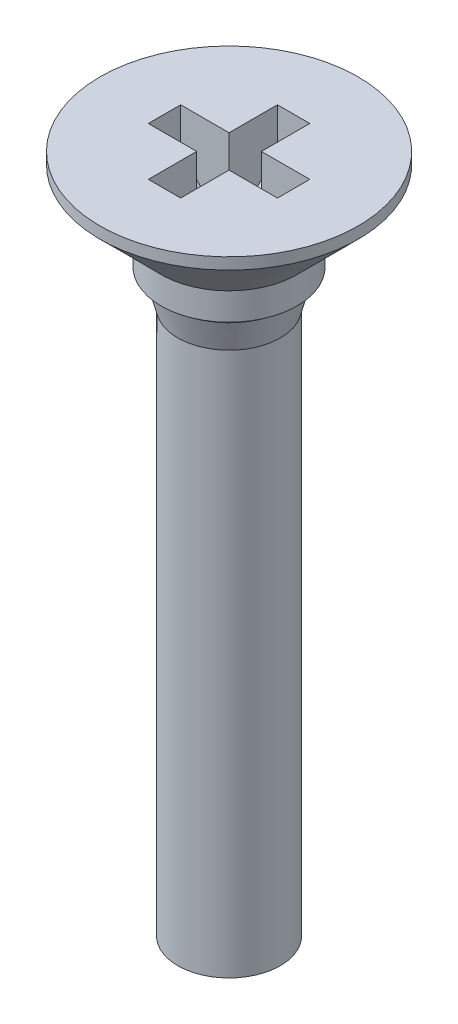
ISO-10303-21;
HEADER;
FILE_DESCRIPTION(('STEP AP214'),'2;1');
FILE_NAME('part.step','',(''),(''),'','','');
FILE_SCHEMA(('AUTOMOTIVE_DESIGN { 1 0 10303 214 1 1 1 1 }'));
ENDSEC;
DATA;
#1=APPLICATION_CONTEXT('core data for automotive mechanical design processes');
#2=APPLICATION_PROTOCOL_DEFINITION('international standard','automotive_design',2000,#1);
#3=PRODUCT_CONTEXT('',#1,'mechanical');
#4=PRODUCT('Part','Part','',(#3));
#5=PRODUCT_RELATED_PRODUCT_CATEGORY('part','',(#4));
#6=PRODUCT_DEFINITION_FORMATION('','',#4);
#7=PRODUCT_DEFINITION_CONTEXT('part definition',#1,'design');
#8=PRODUCT_DEFINITION('design','',#6,#7);
#9=PRODUCT_DEFINITION_SHAPE('','',#8);
#10=(LENGTH_UNIT() NAMED_UNIT(*) SI_UNIT(.MILLI.,.METRE.));
#11=(NAMED_UNIT(*) PLANE_ANGLE_UNIT() SI_UNIT($,.RADIAN.));
#12=(NAMED_UNIT(*) SI_UNIT($,.STERADIAN.) SOLID_ANGLE_UNIT());
#13=UNCERTAINTY_MEASURE_WITH_UNIT(LENGTH_MEASURE(1.E-05),#10,'distance_accuracy_value','');
#14=(GEOMETRIC_REPRESENTATION_CONTEXT(3) GLOBAL_UNCERTAINTY_ASSIGNED_CONTEXT((#13)) GLOBAL_UNIT_ASSIGNED_CONTEXT((#10,
#11,#12)) REPRESENTATION_CONTEXT('',''));
#15=CARTESIAN_POINT('',(0.,0.,0.));
#16=DIRECTION('',(0.,0.,1.));
#17=DIRECTION('',(1.,0.,0.));
#18=AXIS2_PLACEMENT_3D('',#15,#16,#17);
#19=CARTESIAN_POINT('',(0.,-1.55,-0.238));
#20=DIRECTION('',(0.,0.,-1.));
#21=DIRECTION('',(-1.,0.,0.));
#22=AXIS2_PLACEMENT_3D('',#19,#20,#21);
#23=PLANE('',#22);
#24=DIRECTION('',(0.,1.,0.));
#25=VECTOR('',#24,1.);
#26=CARTESIAN_POINT('',(0.238,-1.55,-0.238));
#27=LINE('',#26,#25);
#28=CARTESIAN_POINT('',(0.238,-1.2,-0.238));
#29=VERTEX_POINT('',#28);
#30=CARTESIAN_POINT('',(0.238,0.,-0.238));
#31=VERTEX_POINT('',#30);
#32=EDGE_CURVE('E196',#29,#31,#27,.T.);
#33=ORIENTED_EDGE('',*,*,#32,.F.);
#34=DIRECTION('',(1.,0.,0.));
#35=VECTOR('',#34,1.);
#36=CARTESIAN_POINT('',(-0.350000000000003,-1.2,-0.238));
#37=LINE('',#36,#35);
#38=CARTESIAN_POINT('',(0.350000000000003,-1.2,-0.238));
#39=VERTEX_POINT('',#38);
#40=EDGE_CURVE('E231',#29,#39,#37,.T.);
#41=ORIENTED_EDGE('',*,*,#40,.T.);
#42=DIRECTION('',(0.707106781186546,0.707106781186549,0.));
#43=VECTOR('',#42,1.);
#44=CARTESIAN_POINT('',(0.95,-0.6,-0.238));
#45=LINE('',#44,#43);
#46=CARTESIAN_POINT('',(0.95,-0.6,-0.238));
#47=VERTEX_POINT('',#46);
#48=EDGE_CURVE('E235',#39,#47,#45,.T.);
#49=ORIENTED_EDGE('',*,*,#48,.T.);
#50=DIRECTION('',(0.,1.,0.));
#51=VECTOR('',#50,1.);
#52=CARTESIAN_POINT('',(0.95,0.,-0.238));
#53=LINE('',#52,#51);
#54=CARTESIAN_POINT('',(0.95,0.,-0.238));
#55=VERTEX_POINT('',#54);
#56=EDGE_CURVE('E238',#47,#55,#53,.T.);
#57=ORIENTED_EDGE('',*,*,#56,.T.);
#58=DIRECTION('',(-1.,0.,0.));
#59=VECTOR('',#58,1.);
#60=CARTESIAN_POINT('',(0.95,0.,-0.238));
#61=LINE('',#60,#59);
#62=EDGE_CURVE('E242',#55,#31,#61,.T.);
#63=ORIENTED_EDGE('',*,*,#62,.T.);
#64=EDGE_LOOP('',(#33,#41,#49,#57,#63));
#65=FACE_BOUND('',#64,.T.);
#66=ADVANCED_FACE('F34',(#65),#23,.F.);
#67=CARTESIAN_POINT('',(0.,-1.55,0.238));
#68=DIRECTION('',(0.,0.,-1.));
#69=DIRECTION('',(-1.,0.,0.));
#70=AXIS2_PLACEMENT_3D('',#67,#68,#69);
#71=PLANE('',#70);
#72=DIRECTION('',(1.,0.,0.));
#73=VECTOR('',#72,1.);
#74=CARTESIAN_POINT('',(-0.350000000000003,-1.2,0.238));
#75=LINE('',#74,#73);
#76=CARTESIAN_POINT('',(0.238,-1.2,0.238));
#77=VERTEX_POINT('',#76);
#78=CARTESIAN_POINT('',(0.350000000000003,-1.2,0.238));
#79=VERTEX_POINT('',#78);
#80=EDGE_CURVE('E213',#77,#79,#75,.T.);
#81=ORIENTED_EDGE('',*,*,#80,.F.);
#82=DIRECTION('',(0.,1.,0.));
#83=VECTOR('',#82,1.);
#84=CARTESIAN_POINT('',(0.238,-1.55,0.238));
#85=LINE('',#84,#83);
#86=CARTESIAN_POINT('',(0.238,0.,0.238));
#87=VERTEX_POINT('',#86);
#88=EDGE_CURVE('E42',#77,#87,#85,.T.);
#89=ORIENTED_EDGE('',*,*,#88,.T.);
#90=DIRECTION('',(-1.,0.,0.));
#91=VECTOR('',#90,1.);
#92=CARTESIAN_POINT('',(0.95,0.,0.238));
#93=LINE('',#92,#91);
#94=CARTESIAN_POINT('',(0.95,0.,0.238));
#95=VERTEX_POINT('',#94);
#96=EDGE_CURVE('E222',#95,#87,#93,.T.);
#97=ORIENTED_EDGE('',*,*,#96,.F.);
#98=DIRECTION('',(0.,1.,0.));
#99=VECTOR('',#98,1.);
#100=CARTESIAN_POINT('',(0.95,0.,0.238));
#101=LINE('',#100,#99);
#102=CARTESIAN_POINT('',(0.95,-0.6,0.238));
#103=VERTEX_POINT('',#102);
#104=EDGE_CURVE('E219',#103,#95,#101,.T.);
#105=ORIENTED_EDGE('',*,*,#104,.F.);
#106=DIRECTION('',(0.707106781186546,0.707106781186549,0.));
#107=VECTOR('',#106,1.);
#108=CARTESIAN_POINT('',(0.95,-0.6,0.238));
#109=LINE('',#108,#107);
#110=EDGE_CURVE('E216',#79,#103,#109,.T.);
#111=ORIENTED_EDGE('',*,*,#110,.F.);
#112=EDGE_LOOP('',(#81,#89,#97,#105,#111));
#113=FACE_BOUND('',#112,.T.);
#114=ADVANCED_FACE('F288',(#113),#71,.T.);
#115=CARTESIAN_POINT('',(0.,0.,0.));
#116=DIRECTION('',(0.,-1.,0.));
#117=DIRECTION('',(1.,0.,0.));
#118=AXIS2_PLACEMENT_3D('',#115,#116,#117);
#119=PLANE('',#118);
#120=DIRECTION('',(1.,0.,0.));
#121=VECTOR('',#120,1.);
#122=CARTESIAN_POINT('',(-0.238,0.,0.95));
#123=LINE('',#122,#121);
#124=CARTESIAN_POINT('',(-0.238,0.,0.95));
#125=VERTEX_POINT('',#124);
#126=CARTESIAN_POINT('',(0.238,0.,0.95));
#127=VERTEX_POINT('',#126);
#128=EDGE_CURVE('E197',#125,#127,#123,.T.);
#129=ORIENTED_EDGE('',*,*,#128,.F.);
#130=DIRECTION('',(0.,0.,1.));
#131=VECTOR('',#130,1.);
#132=CARTESIAN_POINT('',(-0.238,0.,-0.95));
#133=LINE('',#132,#131);
#134=CARTESIAN_POINT('',(-0.238,0.,0.238));
#135=VERTEX_POINT('',#134);
#136=EDGE_CURVE('E190',#135,#125,#133,.T.);
#137=ORIENTED_EDGE('',*,*,#136,.F.);
#138=CARTESIAN_POINT('',(-0.95,0.,0.238));
#139=VERTEX_POINT('',#138);
#140=EDGE_CURVE('E221',#135,#139,#93,.T.);
#141=ORIENTED_EDGE('',*,*,#140,.T.);
#142=DIRECTION('',(0.,0.,1.));
#143=VECTOR('',#142,1.);
#144=CARTESIAN_POINT('',(-0.95,0.,-0.238));
#145=LINE('',#144,#143);
#146=CARTESIAN_POINT('',(-0.95,0.,-0.238));
#147=VERTEX_POINT('',#146);
#148=EDGE_CURVE('E252',#147,#139,#145,.T.);
#149=ORIENTED_EDGE('',*,*,#148,.F.);
#150=CARTESIAN_POINT('',(-0.238,0.,-0.238));
#151=VERTEX_POINT('',#150);
#152=EDGE_CURVE('E241',#151,#147,#61,.T.);
#153=ORIENTED_EDGE('',*,*,#152,.F.);
#154=CARTESIAN_POINT('',(-0.238,0.,-0.95));
#155=VERTEX_POINT('',#154);
#156=EDGE_CURVE('E191',#155,#151,#133,.T.);
#157=ORIENTED_EDGE('',*,*,#156,.F.);
#158=DIRECTION('',(1.,0.,0.));
#159=VECTOR('',#158,1.);
#160=CARTESIAN_POINT('',(-0.238,0.,-0.95));
#161=LINE('',#160,#159);
#162=CARTESIAN_POINT('',(0.238,0.,-0.95));
#163=VERTEX_POINT('',#162);
#164=EDGE_CURVE('E199',#155,#163,#161,.T.);
#165=ORIENTED_EDGE('',*,*,#164,.T.);
#166=DIRECTION('',(0.,0.,1.));
#167=VECTOR('',#166,1.);
#168=CARTESIAN_POINT('',(0.238,0.,-0.95));
#169=LINE('',#168,#167);
#170=EDGE_CURVE('E175',#163,#31,#169,.T.);
#171=ORIENTED_EDGE('',*,*,#170,.T.);
#172=ORIENTED_EDGE('',*,*,#62,.F.);
#173=DIRECTION('',(0.,0.,1.));
#174=VECTOR('',#173,1.);
#175=CARTESIAN_POINT('',(0.95,0.,-0.238));
#176=LINE('',#175,#174);
#177=EDGE_CURVE('E255',#55,#95,#176,.T.);
#178=ORIENTED_EDGE('',*,*,#177,.T.);
#179=ORIENTED_EDGE('',*,*,#96,.T.);
#180=EDGE_CURVE('E57',#87,#127,#169,.T.);
#181=ORIENTED_EDGE('',*,*,#180,.T.);
#182=EDGE_LOOP('',(#129,#137,#141,#149,#153,#157,#165,#171,#172,#178,#179,#181));
#183=FACE_BOUND('',#182,.T.);
#184=CARTESIAN_POINT('',(0.,0.,0.));
#185=DIRECTION('',(0.,1.,0.));
#186=DIRECTION('',(-1.,0.,0.));
#187=AXIS2_PLACEMENT_3D('',#184,#185,#186);
#188=CIRCLE('',#187,1.9);
#189=CARTESIAN_POINT('',(-1.9,0.,0.));
#190=VERTEX_POINT('',#189);
#191=EDGE_CURVE('E284',#190,#190,#188,.T.);
#192=ORIENTED_EDGE('',*,*,#191,.T.);
#193=EDGE_LOOP('',(#192));
#194=FACE_BOUND('',#193,.T.);
#195=ADVANCED_FACE('F36',(#183,#194),#119,.F.);
#196=CARTESIAN_POINT('',(0.,0.,0.));
#197=DIRECTION('',(0.,1.,0.));
#198=DIRECTION('',(-1.,0.,0.));
#199=AXIS2_PLACEMENT_3D('',#196,#197,#198);
#200=CYLINDRICAL_SURFACE('',#199,1.9);
#201=ORIENTED_EDGE('',*,*,#191,.F.);
#202=EDGE_LOOP('',(#201));
#203=FACE_BOUND('',#202,.T.);
#204=CARTESIAN_POINT('',(0.,-0.170000000000003,0.));
#205=DIRECTION('',(0.,1.,0.));
#206=DIRECTION('',(-1.,0.,0.));
#207=AXIS2_PLACEMENT_3D('',#204,#205,#206);
#208=CIRCLE('',#207,1.9);
#209=CARTESIAN_POINT('',(-1.9,-0.170000000000003,0.));
#210=VERTEX_POINT('',#209);
#211=EDGE_CURVE('E281',#210,#210,#208,.T.);
#212=ORIENTED_EDGE('',*,*,#211,.T.);
#213=EDGE_LOOP('',(#212));
#214=FACE_BOUND('',#213,.T.);
#215=ADVANCED_FACE('F397',(#203,#214),#200,.T.);
#216=CARTESIAN_POINT('',(0.,-1.07,0.));
#217=DIRECTION('',(0.,1.,0.));
#218=DIRECTION('',(-1.,0.,0.));
#219=AXIS2_PLACEMENT_3D('',#216,#217,#218);
#220=CONICAL_SURFACE('',#219,1.,0.78539816339745);
#221=ORIENTED_EDGE('',*,*,#211,.F.);
#222=EDGE_LOOP('',(#221));
#223=FACE_BOUND('',#222,.T.);
#224=CARTESIAN_POINT('',(0.,-1.07,0.));
#225=DIRECTION('',(0.,1.,0.));
#226=DIRECTION('',(-1.,0.,0.));
#227=AXIS2_PLACEMENT_3D('',#224,#225,#226);
#228=CIRCLE('',#227,1.);
#229=CARTESIAN_POINT('',(-1.,-1.07,0.));
#230=VERTEX_POINT('',#229);
#231=EDGE_CURVE('E278',#230,#230,#228,.T.);
#232=ORIENTED_EDGE('',*,*,#231,.T.);
#233=EDGE_LOOP('',(#232));
#234=FACE_BOUND('',#233,.T.);
#235=ADVANCED_FACE('F394',(#223,#234),#220,.T.);
#236=CARTESIAN_POINT('',(0.,0.,0.));
#237=DIRECTION('',(0.,1.,0.));
#238=DIRECTION('',(-1.,0.,0.));
#239=AXIS2_PLACEMENT_3D('',#236,#237,#238);
#240=CYLINDRICAL_SURFACE('',#239,1.);
#241=ORIENTED_EDGE('',*,*,#231,.F.);
#242=EDGE_LOOP('',(#241));
#243=FACE_BOUND('',#242,.T.);
#244=CARTESIAN_POINT('',(0.,-1.47,0.));
#245=DIRECTION('',(0.,1.,0.));
#246=DIRECTION('',(-1.,0.,0.));
#247=AXIS2_PLACEMENT_3D('',#244,#245,#246);
#248=CIRCLE('',#247,1.);
#249=CARTESIAN_POINT('',(-1.,-1.47,0.));
#250=VERTEX_POINT('',#249);
#251=EDGE_CURVE('E275',#250,#250,#248,.T.);
#252=ORIENTED_EDGE('',*,*,#251,.T.);
#253=EDGE_LOOP('',(#252));
#254=FACE_BOUND('',#253,.T.);
#255=ADVANCED_FACE('F390',(#243,#254),#240,.T.);
#256=CARTESIAN_POINT('',(1.,-1.47,0.));
#257=DIRECTION('',(0.,1.,0.));
#258=DIRECTION('',(-1.,0.,0.));
#259=AXIS2_PLACEMENT_3D('',#256,#257,#258);
#260=PLANE('',#259);
#261=ORIENTED_EDGE('',*,*,#251,.F.);
#262=EDGE_LOOP('',(#261));
#263=FACE_BOUND('',#262,.T.);
#264=CARTESIAN_POINT('',(0.,-1.47,0.));
#265=DIRECTION('',(0.,1.,0.));
#266=DIRECTION('',(-1.,0.,0.));
#267=AXIS2_PLACEMENT_3D('',#264,#265,#266);
#268=CIRCLE('',#267,0.87);
#269=CARTESIAN_POINT('',(-0.87,-1.47,0.));
#270=VERTEX_POINT('',#269);
#271=EDGE_CURVE('E272',#270,#270,#268,.T.);
#272=ORIENTED_EDGE('',*,*,#271,.T.);
#273=EDGE_LOOP('',(#272));
#274=FACE_BOUND('',#273,.T.);
#275=ADVANCED_FACE('F386',(#263,#274),#260,.F.);
#276=CARTESIAN_POINT('',(0.,0.,0.));
#277=DIRECTION('',(0.,1.,0.));
#278=DIRECTION('',(-1.,0.,0.));
#279=AXIS2_PLACEMENT_3D('',#276,#277,#278);
#280=CYLINDRICAL_SURFACE('',#279,0.87);
#281=ORIENTED_EDGE('',*,*,#271,.F.);
#282=EDGE_LOOP('',(#281));
#283=FACE_BOUND('',#282,.T.);
#284=CARTESIAN_POINT('',(0.,-1.56894813172579,0.));
#285=DIRECTION('',(0.,1.,0.));
#286=DIRECTION('',(-1.,0.,0.));
#287=AXIS2_PLACEMENT_3D('',#284,#285,#286);
#288=CIRCLE('',#287,0.87);
#289=CARTESIAN_POINT('',(-0.87,-1.56894813172579,0.));
#290=VERTEX_POINT('',#289);
#291=EDGE_CURVE('E269',#290,#290,#288,.T.);
#292=ORIENTED_EDGE('',*,*,#291,.T.);
#293=EDGE_LOOP('',(#292));
#294=FACE_BOUND('',#293,.T.);
#295=ADVANCED_FACE('F382',(#283,#294),#280,.T.);
#296=CARTESIAN_POINT('',(0.,-2.,0.));
#297=DIRECTION('',(0.,1.,0.));
#298=DIRECTION('',(-1.,0.,0.));
#299=AXIS2_PLACEMENT_3D('',#296,#297,#298);
#300=CONICAL_SURFACE('',#299,0.7545,0.26179938779915);
#301=ORIENTED_EDGE('',*,*,#291,.F.);
#302=EDGE_LOOP('',(#301));
#303=FACE_BOUND('',#302,.T.);
#304=CARTESIAN_POINT('',(0.,-2.,0.));
#305=DIRECTION('',(0.,1.,0.));
#306=DIRECTION('',(-1.,0.,0.));
#307=AXIS2_PLACEMENT_3D('',#304,#305,#306);
#308=CIRCLE('',#307,0.7545);
#309=CARTESIAN_POINT('',(-0.7545,-2.,0.));
#310=VERTEX_POINT('',#309);
#311=EDGE_CURVE('E266',#310,#310,#308,.T.);
#312=ORIENTED_EDGE('',*,*,#311,.T.);
#313=EDGE_LOOP('',(#312));
#314=FACE_BOUND('',#313,.T.);
#315=ADVANCED_FACE('F378',(#303,#314),#300,.T.);
#316=CARTESIAN_POINT('',(0.,0.,0.));
#317=DIRECTION('',(0.,1.,0.));
#318=DIRECTION('',(-1.,0.,0.));
#319=AXIS2_PLACEMENT_3D('',#316,#317,#318);
#320=CYLINDRICAL_SURFACE('',#319,0.7545);
#321=ORIENTED_EDGE('',*,*,#311,.F.);
#322=EDGE_LOOP('',(#321));
#323=FACE_BOUND('',#322,.T.);
#324=CARTESIAN_POINT('',(0.,-10.,0.));
#325=DIRECTION('',(0.,1.,0.));
#326=DIRECTION('',(-1.,0.,0.));
#327=AXIS2_PLACEMENT_3D('',#324,#325,#326);
#328=CIRCLE('',#327,0.754500000000001);
#329=CARTESIAN_POINT('',(-0.7545,-10.,0.));
#330=VERTEX_POINT('',#329);
#331=EDGE_CURVE('E251',#330,#330,#328,.T.);
#332=ORIENTED_EDGE('',*,*,#331,.T.);
#333=EDGE_LOOP('',(#332));
#334=FACE_BOUND('',#333,.T.);
#335=ADVANCED_FACE('F374',(#323,#334),#320,.T.);
#336=CARTESIAN_POINT('',(0.754500000000002,-10.,0.));
#337=DIRECTION('',(0.,1.,0.));
#338=DIRECTION('',(-1.,0.,0.));
#339=AXIS2_PLACEMENT_3D('',#336,#337,#338);
#340=PLANE('',#339);
#341=ORIENTED_EDGE('',*,*,#331,.F.);
#342=EDGE_LOOP('',(#341));
#343=FACE_BOUND('',#342,.T.);
#344=ADVANCED_FACE('F371',(#343),#340,.F.);
#345=CARTESIAN_POINT('',(-0.95,-0.6,-0.238));
#346=DIRECTION('',(-0.707106781186549,-0.707106781186546,0.));
#347=DIRECTION('',(0.707106781186546,-0.707106781186549,0.));
#348=AXIS2_PLACEMENT_3D('',#345,#346,#347);
#349=PLANE('',#348);
#350=DIRECTION('',(0.,0.,1.));
#351=VECTOR('',#350,1.);
#352=CARTESIAN_POINT('',(-0.350000000000003,-1.2,-0.238));
#353=LINE('',#352,#351);
#354=CARTESIAN_POINT('',(-0.350000000000003,-1.2,-0.238));
#355=VERTEX_POINT('',#354);
#356=CARTESIAN_POINT('',(-0.350000000000003,-1.2,0.238));
#357=VERTEX_POINT('',#356);
#358=EDGE_CURVE('E248',#355,#357,#353,.T.);
#359=ORIENTED_EDGE('',*,*,#358,.F.);
#360=DIRECTION('',(0.707106781186546,-0.707106781186549,0.));
#361=VECTOR('',#360,1.);
#362=CARTESIAN_POINT('',(-0.95,-0.6,-0.238));
#363=LINE('',#362,#361);
#364=CARTESIAN_POINT('',(-0.95,-0.6,-0.238));
#365=VERTEX_POINT('',#364);
#366=EDGE_CURVE('E228',#365,#355,#363,.T.);
#367=ORIENTED_EDGE('',*,*,#366,.F.);
#368=DIRECTION('',(0.,0.,1.));
#369=VECTOR('',#368,1.);
#370=CARTESIAN_POINT('',(-0.95,-0.6,-0.238));
#371=LINE('',#370,#369);
#372=CARTESIAN_POINT('',(-0.95,-0.6,0.238));
#373=VERTEX_POINT('',#372);
#374=EDGE_CURVE('E249',#365,#373,#371,.T.);
#375=ORIENTED_EDGE('',*,*,#374,.T.);
#376=DIRECTION('',(0.707106781186546,-0.707106781186549,0.));
#377=VECTOR('',#376,1.);
#378=CARTESIAN_POINT('',(-0.95,-0.6,0.238));
#379=LINE('',#378,#377);
#380=EDGE_CURVE('E210',#373,#357,#379,.T.);
#381=ORIENTED_EDGE('',*,*,#380,.T.);
#382=EDGE_LOOP('',(#359,#367,#375,#381));
#383=FACE_BOUND('',#382,.T.);
#384=ADVANCED_FACE('F325',(#383),#349,.F.);
#385=CARTESIAN_POINT('',(-0.95,0.,-0.238));
#386=DIRECTION('',(-1.,0.,0.));
#387=DIRECTION('',(0.,0.,1.));
#388=AXIS2_PLACEMENT_3D('',#385,#386,#387);
#389=PLANE('',#388);
#390=ORIENTED_EDGE('',*,*,#374,.F.);
#391=DIRECTION('',(0.,-1.,0.));
#392=VECTOR('',#391,1.);
#393=CARTESIAN_POINT('',(-0.95,0.,-0.238));
#394=LINE('',#393,#392);
#395=EDGE_CURVE('E245',#147,#365,#394,.T.);
#396=ORIENTED_EDGE('',*,*,#395,.F.);
#397=ORIENTED_EDGE('',*,*,#148,.T.);
#398=DIRECTION('',(0.,-1.,0.));
#399=VECTOR('',#398,1.);
#400=CARTESIAN_POINT('',(-0.95,0.,0.238));
#401=LINE('',#400,#399);
#402=EDGE_CURVE('E225',#139,#373,#401,.T.);
#403=ORIENTED_EDGE('',*,*,#402,.T.);
#404=EDGE_LOOP('',(#390,#396,#397,#403));
#405=FACE_BOUND('',#404,.T.);
#406=ADVANCED_FACE('F370',(#405),#389,.F.);
#407=CARTESIAN_POINT('',(0.95,0.,-0.238));
#408=DIRECTION('',(1.,0.,0.));
#409=DIRECTION('',(0.,0.,-1.));
#410=AXIS2_PLACEMENT_3D('',#407,#408,#409);
#411=PLANE('',#410);
#412=ORIENTED_EDGE('',*,*,#177,.F.);
#413=ORIENTED_EDGE('',*,*,#56,.F.);
#414=DIRECTION('',(0.,0.,1.));
#415=VECTOR('',#414,1.);
#416=CARTESIAN_POINT('',(0.95,-0.6,-0.238));
#417=LINE('',#416,#415);
#418=EDGE_CURVE('E258',#47,#103,#417,.T.);
#419=ORIENTED_EDGE('',*,*,#418,.T.);
#420=ORIENTED_EDGE('',*,*,#104,.T.);
#421=EDGE_LOOP('',(#412,#413,#419,#420));
#422=FACE_BOUND('',#421,.T.);
#423=ADVANCED_FACE('F297',(#422),#411,.F.);
#424=CARTESIAN_POINT('',(0.95,-0.6,-0.238));
#425=DIRECTION('',(0.707106781186549,-0.707106781186546,0.));
#426=DIRECTION('',(0.707106781186546,0.707106781186549,0.));
#427=AXIS2_PLACEMENT_3D('',#424,#425,#426);
#428=PLANE('',#427);
#429=ORIENTED_EDGE('',*,*,#418,.F.);
#430=ORIENTED_EDGE('',*,*,#48,.F.);
#431=DIRECTION('',(0.,0.,1.));
#432=VECTOR('',#431,1.);
#433=CARTESIAN_POINT('',(0.350000000000003,-1.2,-0.238));
#434=LINE('',#433,#432);
#435=EDGE_CURVE('E260',#39,#79,#434,.T.);
#436=ORIENTED_EDGE('',*,*,#435,.T.);
#437=ORIENTED_EDGE('',*,*,#110,.T.);
#438=EDGE_LOOP('',(#429,#430,#436,#437));
#439=FACE_BOUND('',#438,.T.);
#440=ADVANCED_FACE('F303',(#439),#428,.F.);
#441=CARTESIAN_POINT('',(-0.350000000000003,-1.2,-0.238));
#442=DIRECTION('',(0.,-1.,0.));
#443=DIRECTION('',(0.,0.,-1.));
#444=AXIS2_PLACEMENT_3D('',#441,#442,#443);
#445=PLANE('',#444);
#446=CARTESIAN_POINT('',(-0.238,-1.2,0.238));
#447=VERTEX_POINT('',#446);
#448=EDGE_CURVE('E214',#357,#447,#75,.T.);
#449=ORIENTED_EDGE('',*,*,#448,.T.);
#450=DIRECTION('',(0.,0.,-1.));
#451=VECTOR('',#450,1.);
#452=CARTESIAN_POINT('',(-0.238,-1.2,0.350000000000003));
#453=LINE('',#452,#451);
#454=CARTESIAN_POINT('',(-0.238,-1.2,0.350000000000003));
#455=VERTEX_POINT('',#454);
#456=EDGE_CURVE('E153',#455,#447,#453,.T.);
#457=ORIENTED_EDGE('',*,*,#456,.F.);
#458=DIRECTION('',(1.,0.,0.));
#459=VECTOR('',#458,1.);
#460=CARTESIAN_POINT('',(-0.238,-1.2,0.350000000000003));
#461=LINE('',#460,#459);
#462=CARTESIAN_POINT('',(0.238,-1.2,0.350000000000003));
#463=VERTEX_POINT('',#462);
#464=EDGE_CURVE('E147',#455,#463,#461,.T.);
#465=ORIENTED_EDGE('',*,*,#464,.T.);
#466=DIRECTION('',(0.,0.,-1.));
#467=VECTOR('',#466,1.);
#468=CARTESIAN_POINT('',(0.238,-1.2,0.350000000000003));
#469=LINE('',#468,#467);
#470=EDGE_CURVE('E151',#463,#77,#469,.T.);
#471=ORIENTED_EDGE('',*,*,#470,.T.);
#472=ORIENTED_EDGE('',*,*,#80,.T.);
#473=ORIENTED_EDGE('',*,*,#435,.F.);
#474=ORIENTED_EDGE('',*,*,#40,.F.);
#475=CARTESIAN_POINT('',(0.238,-1.2,-0.350000000000003));
#476=VERTEX_POINT('',#475);
#477=EDGE_CURVE('E49',#29,#476,#469,.T.);
#478=ORIENTED_EDGE('',*,*,#477,.T.);
#479=DIRECTION('',(1.,0.,0.));
#480=VECTOR('',#479,1.);
#481=CARTESIAN_POINT('',(-0.238,-1.2,-0.350000000000003));
#482=LINE('',#481,#480);
#483=CARTESIAN_POINT('',(-0.238,-1.2,-0.350000000000003));
#484=VERTEX_POINT('',#483);
#485=EDGE_CURVE('E158',#484,#476,#482,.T.);
#486=ORIENTED_EDGE('',*,*,#485,.F.);
#487=CARTESIAN_POINT('',(-0.238,-1.2,-0.238));
#488=VERTEX_POINT('',#487);
#489=EDGE_CURVE('E182',#488,#484,#453,.T.);
#490=ORIENTED_EDGE('',*,*,#489,.F.);
#491=EDGE_CURVE('E232',#355,#488,#37,.T.);
#492=ORIENTED_EDGE('',*,*,#491,.F.);
#493=ORIENTED_EDGE('',*,*,#358,.T.);
#494=EDGE_LOOP('',(#449,#457,#465,#471,#472,#473,#474,#478,#486,#490,#492,#493));
#495=FACE_BOUND('',#494,.T.);
#496=ADVANCED_FACE('F150',(#495),#445,.F.);
#497=ORIENTED_EDGE('',*,*,#491,.T.);
#498=DIRECTION('',(0.,1.,0.));
#499=VECTOR('',#498,1.);
#500=CARTESIAN_POINT('',(-0.238,-1.55,-0.238));
#501=LINE('',#500,#499);
#502=EDGE_CURVE('E207',#488,#151,#501,.T.);
#503=ORIENTED_EDGE('',*,*,#502,.T.);
#504=ORIENTED_EDGE('',*,*,#152,.T.);
#505=ORIENTED_EDGE('',*,*,#395,.T.);
#506=ORIENTED_EDGE('',*,*,#366,.T.);
#507=EDGE_LOOP('',(#497,#503,#504,#505,#506));
#508=FACE_BOUND('',#507,.T.);
#509=ADVANCED_FACE('F320',(#508),#23,.F.);
#510=DIRECTION('',(0.,1.,0.));
#511=VECTOR('',#510,1.);
#512=CARTESIAN_POINT('',(-0.238,-1.55,0.238));
#513=LINE('',#512,#511);
#514=EDGE_CURVE('E11',#447,#135,#513,.T.);
#515=ORIENTED_EDGE('',*,*,#514,.F.);
#516=ORIENTED_EDGE('',*,*,#448,.F.);
#517=ORIENTED_EDGE('',*,*,#380,.F.);
#518=ORIENTED_EDGE('',*,*,#402,.F.);
#519=ORIENTED_EDGE('',*,*,#140,.F.);
#520=EDGE_LOOP('',(#515,#516,#517,#518,#519));
#521=FACE_BOUND('',#520,.T.);
#522=ADVANCED_FACE('F330',(#521),#71,.T.);
#523=CARTESIAN_POINT('',(-0.238,-0.6,0.95));
#524=DIRECTION('',(0.,-0.707106781186546,0.707106781186549));
#525=DIRECTION('',(0.,-0.707106781186549,-0.707106781186546));
#526=AXIS2_PLACEMENT_3D('',#523,#524,#525);
#527=PLANE('',#526);
#528=ORIENTED_EDGE('',*,*,#464,.F.);
#529=DIRECTION('',(0.,-0.707106781186549,-0.707106781186546));
#530=VECTOR('',#529,1.);
#531=CARTESIAN_POINT('',(-0.238,-0.6,0.95));
#532=LINE('',#531,#530);
#533=CARTESIAN_POINT('',(-0.238,-0.6,0.95));
#534=VERTEX_POINT('',#533);
#535=EDGE_CURVE('E180',#534,#455,#532,.T.);
#536=ORIENTED_EDGE('',*,*,#535,.F.);
#537=DIRECTION('',(1.,0.,0.));
#538=VECTOR('',#537,1.);
#539=CARTESIAN_POINT('',(-0.238,-0.6,0.95));
#540=LINE('',#539,#538);
#541=CARTESIAN_POINT('',(0.238,-0.6,0.95));
#542=VERTEX_POINT('',#541);
#543=EDGE_CURVE('E167',#534,#542,#540,.T.);
#544=ORIENTED_EDGE('',*,*,#543,.T.);
#545=DIRECTION('',(0.,-0.707106781186549,-0.707106781186546));
#546=VECTOR('',#545,1.);
#547=CARTESIAN_POINT('',(0.238,-0.6,0.95));
#548=LINE('',#547,#546);
#549=EDGE_CURVE('E163',#542,#463,#548,.T.);
#550=ORIENTED_EDGE('',*,*,#549,.T.);
#551=EDGE_LOOP('',(#528,#536,#544,#550));
#552=FACE_BOUND('',#551,.T.);
#553=ADVANCED_FACE('F166',(#552),#527,.F.);
#554=CARTESIAN_POINT('',(-0.238,-1.55,0.));
#555=DIRECTION('',(-1.,0.,0.));
#556=DIRECTION('',(0.,0.,1.));
#557=AXIS2_PLACEMENT_3D('',#554,#555,#556);
#558=PLANE('',#557);
#559=ORIENTED_EDGE('',*,*,#514,.T.);
#560=ORIENTED_EDGE('',*,*,#136,.T.);
#561=DIRECTION('',(0.,-1.,0.));
#562=VECTOR('',#561,1.);
#563=CARTESIAN_POINT('',(-0.238,0.,0.95));
#564=LINE('',#563,#562);
#565=EDGE_CURVE('E159',#125,#534,#564,.T.);
#566=ORIENTED_EDGE('',*,*,#565,.T.);
#567=ORIENTED_EDGE('',*,*,#535,.T.);
#568=ORIENTED_EDGE('',*,*,#456,.T.);
#569=EDGE_LOOP('',(#559,#560,#566,#567,#568));
#570=FACE_BOUND('',#569,.T.);
#571=ADVANCED_FACE('F335',(#570),#558,.F.);
#572=CARTESIAN_POINT('',(0.238,-1.55,0.));
#573=DIRECTION('',(-1.,0.,0.));
#574=DIRECTION('',(0.,0.,1.));
#575=AXIS2_PLACEMENT_3D('',#572,#573,#574);
#576=PLANE('',#575);
#577=ORIENTED_EDGE('',*,*,#470,.F.);
#578=ORIENTED_EDGE('',*,*,#549,.F.);
#579=DIRECTION('',(0.,-1.,0.));
#580=VECTOR('',#579,1.);
#581=CARTESIAN_POINT('',(0.238,0.,0.95));
#582=LINE('',#581,#580);
#583=EDGE_CURVE('E178',#127,#542,#582,.T.);
#584=ORIENTED_EDGE('',*,*,#583,.F.);
#585=ORIENTED_EDGE('',*,*,#180,.F.);
#586=ORIENTED_EDGE('',*,*,#88,.F.);
#587=EDGE_LOOP('',(#577,#578,#584,#585,#586));
#588=FACE_BOUND('',#587,.T.);
#589=ADVANCED_FACE('F162',(#588),#576,.T.);
#590=CARTESIAN_POINT('',(-0.238,0.,0.95));
#591=DIRECTION('',(0.,0.,1.));
#592=DIRECTION('',(1.,0.,0.));
#593=AXIS2_PLACEMENT_3D('',#590,#591,#592);
#594=PLANE('',#593);
#595=ORIENTED_EDGE('',*,*,#543,.F.);
#596=ORIENTED_EDGE('',*,*,#565,.F.);
#597=ORIENTED_EDGE('',*,*,#128,.T.);
#598=ORIENTED_EDGE('',*,*,#583,.T.);
#599=EDGE_LOOP('',(#595,#596,#597,#598));
#600=FACE_BOUND('',#599,.T.);
#601=ADVANCED_FACE('F339',(#600),#594,.F.);
#602=ORIENTED_EDGE('',*,*,#489,.T.);
#603=DIRECTION('',(0.,0.707106781186549,-0.707106781186546));
#604=VECTOR('',#603,1.);
#605=CARTESIAN_POINT('',(-0.238,-0.6,-0.95));
#606=LINE('',#605,#604);
#607=CARTESIAN_POINT('',(-0.238,-0.6,-0.95));
#608=VERTEX_POINT('',#607);
#609=EDGE_CURVE('E184',#484,#608,#606,.T.);
#610=ORIENTED_EDGE('',*,*,#609,.T.);
#611=DIRECTION('',(0.,1.,0.));
#612=VECTOR('',#611,1.);
#613=CARTESIAN_POINT('',(-0.238,0.,-0.95));
#614=LINE('',#613,#612);
#615=EDGE_CURVE('E187',#608,#155,#614,.T.);
#616=ORIENTED_EDGE('',*,*,#615,.T.);
#617=ORIENTED_EDGE('',*,*,#156,.T.);
#618=ORIENTED_EDGE('',*,*,#502,.F.);
#619=EDGE_LOOP('',(#602,#610,#616,#617,#618));
#620=FACE_BOUND('',#619,.T.);
#621=ADVANCED_FACE('F317',(#620),#558,.F.);
#622=ORIENTED_EDGE('',*,*,#32,.T.);
#623=ORIENTED_EDGE('',*,*,#170,.F.);
#624=DIRECTION('',(0.,1.,0.));
#625=VECTOR('',#624,1.);
#626=CARTESIAN_POINT('',(0.238,0.,-0.95));
#627=LINE('',#626,#625);
#628=CARTESIAN_POINT('',(0.238,-0.6,-0.95));
#629=VERTEX_POINT('',#628);
#630=EDGE_CURVE('E173',#629,#163,#627,.T.);
#631=ORIENTED_EDGE('',*,*,#630,.F.);
#632=DIRECTION('',(0.,0.707106781186549,-0.707106781186546));
#633=VECTOR('',#632,1.);
#634=CARTESIAN_POINT('',(0.238,-0.6,-0.95));
#635=LINE('',#634,#633);
#636=EDGE_CURVE('E164',#476,#629,#635,.T.);
#637=ORIENTED_EDGE('',*,*,#636,.F.);
#638=ORIENTED_EDGE('',*,*,#477,.F.);
#639=EDGE_LOOP('',(#622,#623,#631,#637,#638));
#640=FACE_BOUND('',#639,.T.);
#641=ADVANCED_FACE('F310',(#640),#576,.T.);
#642=CARTESIAN_POINT('',(-0.238,0.,-0.95));
#643=DIRECTION('',(0.,0.,-1.));
#644=DIRECTION('',(-1.,0.,0.));
#645=AXIS2_PLACEMENT_3D('',#642,#643,#644);
#646=PLANE('',#645);
#647=ORIENTED_EDGE('',*,*,#164,.F.);
#648=ORIENTED_EDGE('',*,*,#615,.F.);
#649=DIRECTION('',(1.,0.,0.));
#650=VECTOR('',#649,1.);
#651=CARTESIAN_POINT('',(-0.238,-0.6,-0.95));
#652=LINE('',#651,#650);
#653=EDGE_CURVE('E202',#608,#629,#652,.T.);
#654=ORIENTED_EDGE('',*,*,#653,.T.);
#655=ORIENTED_EDGE('',*,*,#630,.T.);
#656=EDGE_LOOP('',(#647,#648,#654,#655));
#657=FACE_BOUND('',#656,.T.);
#658=ADVANCED_FACE('F313',(#657),#646,.F.);
#659=CARTESIAN_POINT('',(-0.238,-0.6,-0.95));
#660=DIRECTION('',(0.,-0.707106781186546,-0.707106781186549));
#661=DIRECTION('',(0.,0.707106781186549,-0.707106781186546));
#662=AXIS2_PLACEMENT_3D('',#659,#660,#661);
#663=PLANE('',#662);
#664=ORIENTED_EDGE('',*,*,#653,.F.);
#665=ORIENTED_EDGE('',*,*,#609,.F.);
#666=ORIENTED_EDGE('',*,*,#485,.T.);
#667=ORIENTED_EDGE('',*,*,#636,.T.);
#668=EDGE_LOOP('',(#664,#665,#666,#667));
#669=FACE_BOUND('',#668,.T.);
#670=ADVANCED_FACE('F308',(#669),#663,.F.);
#671=CLOSED_SHELL('',(#66,#114,#195,#215,#235,#255,#275,#295,#315,#335,#344,#384,#406,#423,#440,
#496,#509,#522,#553,#571,#589,#601,#621,#641,#658,#670));
#672=MANIFOLD_SOLID_BREP('B2',#671);
#673=ADVANCED_BREP_SHAPE_REPRESENTATION('',(#18,#672),#14);
#674=SHAPE_DEFINITION_REPRESENTATION(#9,#673);
ENDSEC;
END-ISO-10303-21;
